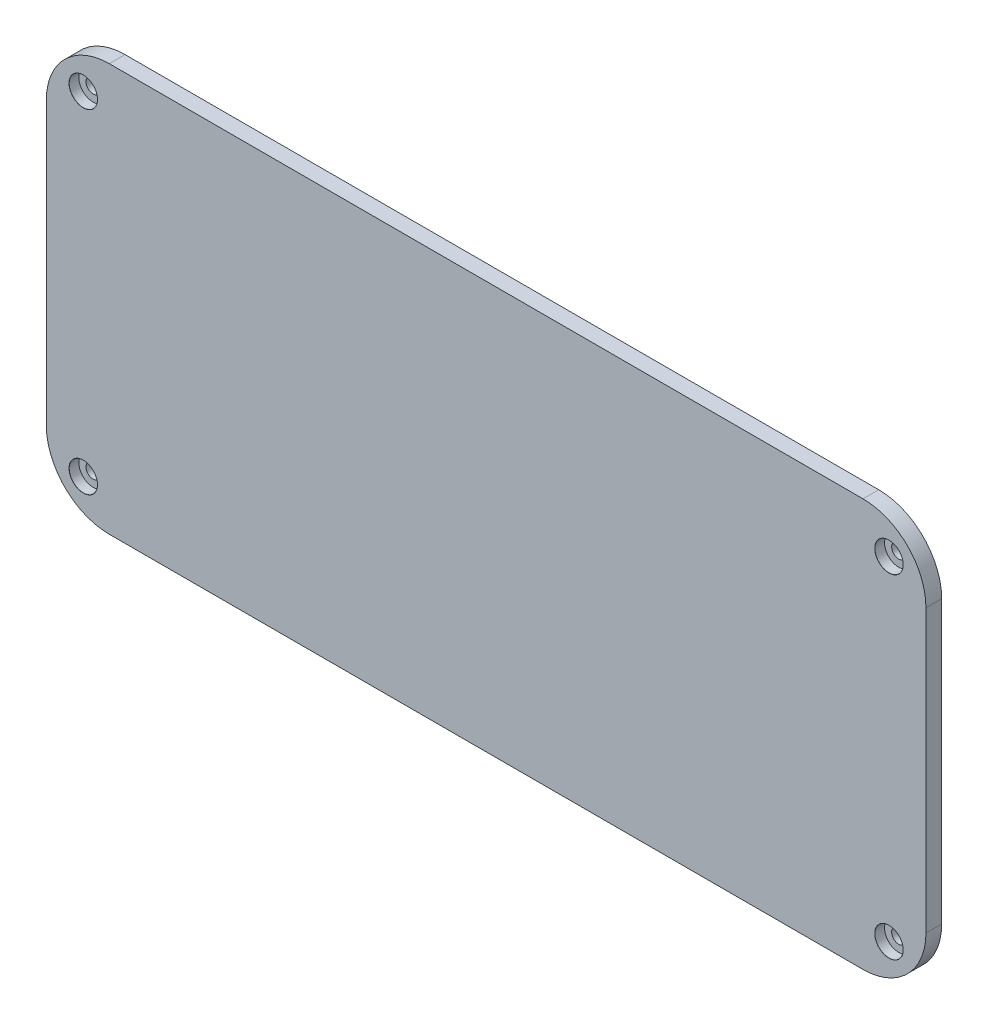
ISO-10303-21;
HEADER;
FILE_DESCRIPTION(('STEP AP214'),'2;1');
FILE_NAME('part.step','',(''),(''),'','','');
FILE_SCHEMA(('AUTOMOTIVE_DESIGN { 1 0 10303 214 1 1 1 1 }'));
ENDSEC;
DATA;
#1=APPLICATION_CONTEXT('core data for automotive mechanical design processes');
#2=APPLICATION_PROTOCOL_DEFINITION('international standard','automotive_design',2000,#1);
#3=PRODUCT_CONTEXT('',#1,'mechanical');
#4=PRODUCT('Part','Part','',(#3));
#5=PRODUCT_RELATED_PRODUCT_CATEGORY('part','',(#4));
#6=PRODUCT_DEFINITION_FORMATION('','',#4);
#7=PRODUCT_DEFINITION_CONTEXT('part definition',#1,'design');
#8=PRODUCT_DEFINITION('design','',#6,#7);
#9=PRODUCT_DEFINITION_SHAPE('','',#8);
#10=(LENGTH_UNIT() NAMED_UNIT(*) SI_UNIT(.MILLI.,.METRE.));
#11=(NAMED_UNIT(*) PLANE_ANGLE_UNIT() SI_UNIT($,.RADIAN.));
#12=(NAMED_UNIT(*) SI_UNIT($,.STERADIAN.) SOLID_ANGLE_UNIT());
#13=UNCERTAINTY_MEASURE_WITH_UNIT(LENGTH_MEASURE(1.E-05),#10,'distance_accuracy_value','');
#14=(GEOMETRIC_REPRESENTATION_CONTEXT(3) GLOBAL_UNCERTAINTY_ASSIGNED_CONTEXT((#13)) GLOBAL_UNIT_ASSIGNED_CONTEXT((#10,
#11,#12)) REPRESENTATION_CONTEXT('',''));
#15=CARTESIAN_POINT('',(0.,0.,0.));
#16=DIRECTION('',(0.,0.,1.));
#17=DIRECTION('',(1.,0.,0.));
#18=AXIS2_PLACEMENT_3D('',#15,#16,#17);
#19=CARTESIAN_POINT('',(-119.75,44.7500000000002,0.));
#20=DIRECTION('',(0.,0.,-1.));
#21=DIRECTION('',(-1.,0.,0.));
#22=AXIS2_PLACEMENT_3D('',#19,#20,#21);
#23=PLANE('',#22);
#24=CARTESIAN_POINT('',(-119.75,44.7500000000002,0.));
#25=DIRECTION('',(0.,0.,1.));
#26=DIRECTION('',(-1.,0.,0.));
#27=AXIS2_PLACEMENT_3D('',#24,#25,#26);
#28=CIRCLE('',#27,20.);
#29=CARTESIAN_POINT('',(-119.75,64.7500000000001,0.));
#30=VERTEX_POINT('',#29);
#31=CARTESIAN_POINT('',(-139.75,44.7500000000001,0.));
#32=VERTEX_POINT('',#31);
#33=EDGE_CURVE('E291',#30,#32,#28,.T.);
#34=ORIENTED_EDGE('',*,*,#33,.F.);
#35=DIRECTION('',(-1.,0.,0.));
#36=VECTOR('',#35,1.);
#37=CARTESIAN_POINT('',(-119.75,64.7500000000001,0.));
#38=LINE('',#37,#36);
#39=CARTESIAN_POINT('',(119.75,64.7500000000002,0.));
#40=VERTEX_POINT('',#39);
#41=EDGE_CURVE('E276',#40,#30,#38,.T.);
#42=ORIENTED_EDGE('',*,*,#41,.F.);
#43=CARTESIAN_POINT('',(119.75,44.7500000000002,0.));
#44=DIRECTION('',(0.,0.,1.));
#45=DIRECTION('',(-1.,0.,0.));
#46=AXIS2_PLACEMENT_3D('',#43,#44,#45);
#47=CIRCLE('',#46,20.);
#48=CARTESIAN_POINT('',(139.75,44.7500000000001,0.));
#49=VERTEX_POINT('',#48);
#50=EDGE_CURVE('E304',#49,#40,#47,.T.);
#51=ORIENTED_EDGE('',*,*,#50,.F.);
#52=DIRECTION('',(0.,1.,0.));
#53=VECTOR('',#52,1.);
#54=CARTESIAN_POINT('',(139.75,44.7500000000001,0.));
#55=LINE('',#54,#53);
#56=CARTESIAN_POINT('',(139.75,-44.7499999999999,0.));
#57=VERTEX_POINT('',#56);
#58=EDGE_CURVE('E302',#57,#49,#55,.T.);
#59=ORIENTED_EDGE('',*,*,#58,.F.);
#60=CARTESIAN_POINT('',(119.75,-44.7499999999999,0.));
#61=DIRECTION('',(0.,0.,1.));
#62=DIRECTION('',(-1.,0.,0.));
#63=AXIS2_PLACEMENT_3D('',#60,#61,#62);
#64=CIRCLE('',#63,20.);
#65=CARTESIAN_POINT('',(119.75,-64.7499999999999,0.));
#66=VERTEX_POINT('',#65);
#67=EDGE_CURVE('E300',#66,#57,#64,.T.);
#68=ORIENTED_EDGE('',*,*,#67,.F.);
#69=DIRECTION('',(1.,0.,0.));
#70=VECTOR('',#69,1.);
#71=CARTESIAN_POINT('',(-119.75,-64.7499999999999,0.));
#72=LINE('',#71,#70);
#73=CARTESIAN_POINT('',(-119.75,-64.7499999999999,0.));
#74=VERTEX_POINT('',#73);
#75=EDGE_CURVE('E298',#74,#66,#72,.T.);
#76=ORIENTED_EDGE('',*,*,#75,.F.);
#77=CARTESIAN_POINT('',(-119.75,-44.7499999999999,0.));
#78=DIRECTION('',(0.,0.,1.));
#79=DIRECTION('',(-1.,0.,0.));
#80=AXIS2_PLACEMENT_3D('',#77,#78,#79);
#81=CIRCLE('',#80,20.);
#82=CARTESIAN_POINT('',(-139.75,-44.7499999999999,0.));
#83=VERTEX_POINT('',#82);
#84=EDGE_CURVE('E296',#83,#74,#81,.T.);
#85=ORIENTED_EDGE('',*,*,#84,.F.);
#86=DIRECTION('',(0.,-1.,0.));
#87=VECTOR('',#86,1.);
#88=CARTESIAN_POINT('',(-139.75,44.7500000000001,0.));
#89=LINE('',#88,#87);
#90=EDGE_CURVE('E294',#32,#83,#89,.T.);
#91=ORIENTED_EDGE('',*,*,#90,.F.);
#92=EDGE_LOOP('',(#34,#42,#51,#59,#68,#76,#85,#91));
#93=FACE_BOUND('',#92,.T.);
#94=CARTESIAN_POINT('',(128.,-53.,0.));
#95=DIRECTION('',(0.,0.,-1.));
#96=DIRECTION('',(-1.,0.,0.));
#97=AXIS2_PLACEMENT_3D('',#94,#95,#96);
#98=CIRCLE('',#97,2.25);
#99=CARTESIAN_POINT('',(125.75,-53.,0.));
#100=VERTEX_POINT('',#99);
#101=EDGE_CURVE('E271',#100,#100,#98,.T.);
#102=ORIENTED_EDGE('',*,*,#101,.F.);
#103=EDGE_LOOP('',(#102));
#104=FACE_BOUND('',#103,.T.);
#105=CARTESIAN_POINT('',(128.,53.,0.));
#106=DIRECTION('',(0.,0.,-1.));
#107=DIRECTION('',(-1.,0.,0.));
#108=AXIS2_PLACEMENT_3D('',#105,#106,#107);
#109=CIRCLE('',#108,2.25);
#110=CARTESIAN_POINT('',(125.75,53.,0.));
#111=VERTEX_POINT('',#110);
#112=EDGE_CURVE('E258',#111,#111,#109,.T.);
#113=ORIENTED_EDGE('',*,*,#112,.F.);
#114=EDGE_LOOP('',(#113));
#115=FACE_BOUND('',#114,.T.);
#116=CARTESIAN_POINT('',(-128.,-53.,0.));
#117=DIRECTION('',(0.,0.,-1.));
#118=DIRECTION('',(-1.,0.,0.));
#119=AXIS2_PLACEMENT_3D('',#116,#117,#118);
#120=CIRCLE('',#119,2.25);
#121=CARTESIAN_POINT('',(-130.25,-53.,0.));
#122=VERTEX_POINT('',#121);
#123=EDGE_CURVE('E245',#122,#122,#120,.T.);
#124=ORIENTED_EDGE('',*,*,#123,.F.);
#125=EDGE_LOOP('',(#124));
#126=FACE_BOUND('',#125,.T.);
#127=CARTESIAN_POINT('',(-128.,53.,0.));
#128=DIRECTION('',(0.,0.,-1.));
#129=DIRECTION('',(-1.,0.,0.));
#130=AXIS2_PLACEMENT_3D('',#127,#128,#129);
#131=CIRCLE('',#130,2.25);
#132=CARTESIAN_POINT('',(-130.25,53.,0.));
#133=VERTEX_POINT('',#132);
#134=EDGE_CURVE('E43',#133,#133,#131,.T.);
#135=ORIENTED_EDGE('',*,*,#134,.F.);
#136=EDGE_LOOP('',(#135));
#137=FACE_BOUND('',#136,.T.);
#138=DIRECTION('',(1.,0.,0.));
#139=VECTOR('',#138,1.);
#140=CARTESIAN_POINT('',(47.75,37.75,0.));
#141=LINE('',#140,#139);
#142=CARTESIAN_POINT('',(-47.75,37.75,0.));
#143=VERTEX_POINT('',#142);
#144=CARTESIAN_POINT('',(47.75,37.75,0.));
#145=VERTEX_POINT('',#144);
#146=EDGE_CURVE('E208',#143,#145,#141,.T.);
#147=ORIENTED_EDGE('',*,*,#146,.F.);
#148=DIRECTION('',(0.,1.,0.));
#149=VECTOR('',#148,1.);
#150=CARTESIAN_POINT('',(-47.75,37.75,0.));
#151=LINE('',#150,#149);
#152=CARTESIAN_POINT('',(-47.75,-37.75,0.));
#153=VERTEX_POINT('',#152);
#154=EDGE_CURVE('E173',#153,#143,#151,.T.);
#155=ORIENTED_EDGE('',*,*,#154,.F.);
#156=DIRECTION('',(-1.,0.,0.));
#157=VECTOR('',#156,1.);
#158=CARTESIAN_POINT('',(47.75,-37.75,0.));
#159=LINE('',#158,#157);
#160=CARTESIAN_POINT('',(47.75,-37.75,0.));
#161=VERTEX_POINT('',#160);
#162=EDGE_CURVE('E199',#161,#153,#159,.T.);
#163=ORIENTED_EDGE('',*,*,#162,.F.);
#164=DIRECTION('',(0.,-1.,0.));
#165=VECTOR('',#164,1.);
#166=CARTESIAN_POINT('',(47.75,37.75,0.));
#167=LINE('',#166,#165);
#168=EDGE_CURVE('E210',#145,#161,#167,.T.);
#169=ORIENTED_EDGE('',*,*,#168,.F.);
#170=EDGE_LOOP('',(#147,#155,#163,#169));
#171=FACE_BOUND('',#170,.T.);
#172=ADVANCED_FACE('F39',(#93,#104,#115,#126,#137,#171),#23,.T.);
#173=CARTESIAN_POINT('',(-119.75,44.7500000000002,5.));
#174=DIRECTION('',(0.,0.,-1.));
#175=DIRECTION('',(-1.,0.,0.));
#176=AXIS2_PLACEMENT_3D('',#173,#174,#175);
#177=CYLINDRICAL_SURFACE('',#176,20.);
#178=ORIENTED_EDGE('',*,*,#33,.T.);
#179=DIRECTION('',(0.,0.,-1.));
#180=VECTOR('',#179,1.);
#181=CARTESIAN_POINT('',(-139.75,44.7500000000001,5.));
#182=LINE('',#181,#180);
#183=CARTESIAN_POINT('',(-139.75,44.7500000000001,5.));
#184=VERTEX_POINT('',#183);
#185=EDGE_CURVE('E11',#184,#32,#182,.T.);
#186=ORIENTED_EDGE('',*,*,#185,.F.);
#187=CARTESIAN_POINT('',(-119.75,44.7500000000002,5.));
#188=DIRECTION('',(0.,0.,1.));
#189=DIRECTION('',(-1.,0.,0.));
#190=AXIS2_PLACEMENT_3D('',#187,#188,#189);
#191=CIRCLE('',#190,20.);
#192=CARTESIAN_POINT('',(-119.75,64.7500000000001,5.));
#193=VERTEX_POINT('',#192);
#194=EDGE_CURVE('E272',#193,#184,#191,.T.);
#195=ORIENTED_EDGE('',*,*,#194,.F.);
#196=DIRECTION('',(0.,0.,-1.));
#197=VECTOR('',#196,1.);
#198=CARTESIAN_POINT('',(-119.75,64.7500000000001,5.));
#199=LINE('',#198,#197);
#200=EDGE_CURVE('E290',#193,#30,#199,.T.);
#201=ORIENTED_EDGE('',*,*,#200,.T.);
#202=EDGE_LOOP('',(#178,#186,#195,#201));
#203=FACE_BOUND('',#202,.T.);
#204=ADVANCED_FACE('F41',(#203),#177,.T.);
#205=CARTESIAN_POINT('',(-139.75,44.7500000000001,5.));
#206=DIRECTION('',(1.,0.,0.));
#207=DIRECTION('',(0.,0.,-1.));
#208=AXIS2_PLACEMENT_3D('',#205,#206,#207);
#209=PLANE('',#208);
#210=ORIENTED_EDGE('',*,*,#90,.T.);
#211=DIRECTION('',(0.,0.,-1.));
#212=VECTOR('',#211,1.);
#213=CARTESIAN_POINT('',(-139.75,-44.7499999999999,5.));
#214=LINE('',#213,#212);
#215=CARTESIAN_POINT('',(-139.75,-44.7499999999999,5.));
#216=VERTEX_POINT('',#215);
#217=EDGE_CURVE('E48',#216,#83,#214,.T.);
#218=ORIENTED_EDGE('',*,*,#217,.F.);
#219=DIRECTION('',(0.,-1.,0.));
#220=VECTOR('',#219,1.);
#221=CARTESIAN_POINT('',(-139.75,44.7500000000001,5.));
#222=LINE('',#221,#220);
#223=EDGE_CURVE('E275',#184,#216,#222,.T.);
#224=ORIENTED_EDGE('',*,*,#223,.F.);
#225=ORIENTED_EDGE('',*,*,#185,.T.);
#226=EDGE_LOOP('',(#210,#218,#224,#225));
#227=FACE_BOUND('',#226,.T.);
#228=ADVANCED_FACE('F464',(#227),#209,.F.);
#229=CARTESIAN_POINT('',(-119.75,-44.7499999999999,5.));
#230=DIRECTION('',(0.,0.,-1.));
#231=DIRECTION('',(-1.,0.,0.));
#232=AXIS2_PLACEMENT_3D('',#229,#230,#231);
#233=CYLINDRICAL_SURFACE('',#232,20.);
#234=ORIENTED_EDGE('',*,*,#84,.T.);
#235=DIRECTION('',(0.,0.,-1.));
#236=VECTOR('',#235,1.);
#237=CARTESIAN_POINT('',(-119.75,-64.7499999999999,5.));
#238=LINE('',#237,#236);
#239=CARTESIAN_POINT('',(-119.75,-64.7499999999999,5.));
#240=VERTEX_POINT('',#239);
#241=EDGE_CURVE('E321',#240,#74,#238,.T.);
#242=ORIENTED_EDGE('',*,*,#241,.F.);
#243=CARTESIAN_POINT('',(-119.75,-44.7499999999999,5.));
#244=DIRECTION('',(0.,0.,1.));
#245=DIRECTION('',(-1.,0.,0.));
#246=AXIS2_PLACEMENT_3D('',#243,#244,#245);
#247=CIRCLE('',#246,20.);
#248=EDGE_CURVE('E278',#216,#240,#247,.T.);
#249=ORIENTED_EDGE('',*,*,#248,.F.);
#250=ORIENTED_EDGE('',*,*,#217,.T.);
#251=EDGE_LOOP('',(#234,#242,#249,#250));
#252=FACE_BOUND('',#251,.T.);
#253=ADVANCED_FACE('F461',(#252),#233,.T.);
#254=CARTESIAN_POINT('',(-119.75,-64.7499999999999,5.));
#255=DIRECTION('',(0.,1.,0.));
#256=DIRECTION('',(-1.,0.,0.));
#257=AXIS2_PLACEMENT_3D('',#254,#255,#256);
#258=PLANE('',#257);
#259=ORIENTED_EDGE('',*,*,#75,.T.);
#260=DIRECTION('',(0.,0.,-1.));
#261=VECTOR('',#260,1.);
#262=CARTESIAN_POINT('',(119.75,-64.7499999999999,5.));
#263=LINE('',#262,#261);
#264=CARTESIAN_POINT('',(119.75,-64.7499999999999,5.));
#265=VERTEX_POINT('',#264);
#266=EDGE_CURVE('E318',#265,#66,#263,.T.);
#267=ORIENTED_EDGE('',*,*,#266,.F.);
#268=DIRECTION('',(1.,0.,0.));
#269=VECTOR('',#268,1.);
#270=CARTESIAN_POINT('',(-119.75,-64.7499999999999,5.));
#271=LINE('',#270,#269);
#272=EDGE_CURVE('E280',#240,#265,#271,.T.);
#273=ORIENTED_EDGE('',*,*,#272,.F.);
#274=ORIENTED_EDGE('',*,*,#241,.T.);
#275=EDGE_LOOP('',(#259,#267,#273,#274));
#276=FACE_BOUND('',#275,.T.);
#277=ADVANCED_FACE('F457',(#276),#258,.F.);
#278=CARTESIAN_POINT('',(119.75,-44.7499999999999,5.));
#279=DIRECTION('',(0.,0.,-1.));
#280=DIRECTION('',(-1.,0.,0.));
#281=AXIS2_PLACEMENT_3D('',#278,#279,#280);
#282=CYLINDRICAL_SURFACE('',#281,20.);
#283=ORIENTED_EDGE('',*,*,#67,.T.);
#284=DIRECTION('',(0.,0.,-1.));
#285=VECTOR('',#284,1.);
#286=CARTESIAN_POINT('',(139.75,-44.7499999999999,5.));
#287=LINE('',#286,#285);
#288=CARTESIAN_POINT('',(139.75,-44.7499999999999,5.));
#289=VERTEX_POINT('',#288);
#290=EDGE_CURVE('E315',#289,#57,#287,.T.);
#291=ORIENTED_EDGE('',*,*,#290,.F.);
#292=CARTESIAN_POINT('',(119.75,-44.7499999999999,5.));
#293=DIRECTION('',(0.,0.,1.));
#294=DIRECTION('',(-1.,0.,0.));
#295=AXIS2_PLACEMENT_3D('',#292,#293,#294);
#296=CIRCLE('',#295,20.);
#297=EDGE_CURVE('E282',#265,#289,#296,.T.);
#298=ORIENTED_EDGE('',*,*,#297,.F.);
#299=ORIENTED_EDGE('',*,*,#266,.T.);
#300=EDGE_LOOP('',(#283,#291,#298,#299));
#301=FACE_BOUND('',#300,.T.);
#302=ADVANCED_FACE('F453',(#301),#282,.T.);
#303=CARTESIAN_POINT('',(139.75,44.7500000000001,5.));
#304=DIRECTION('',(-1.,0.,0.));
#305=DIRECTION('',(0.,0.,1.));
#306=AXIS2_PLACEMENT_3D('',#303,#304,#305);
#307=PLANE('',#306);
#308=ORIENTED_EDGE('',*,*,#58,.T.);
#309=DIRECTION('',(0.,0.,-1.));
#310=VECTOR('',#309,1.);
#311=CARTESIAN_POINT('',(139.75,44.7500000000001,5.));
#312=LINE('',#311,#310);
#313=CARTESIAN_POINT('',(139.75,44.7500000000001,5.));
#314=VERTEX_POINT('',#313);
#315=EDGE_CURVE('E312',#314,#49,#312,.T.);
#316=ORIENTED_EDGE('',*,*,#315,.F.);
#317=DIRECTION('',(0.,1.,0.));
#318=VECTOR('',#317,1.);
#319=CARTESIAN_POINT('',(139.75,44.7500000000001,5.));
#320=LINE('',#319,#318);
#321=EDGE_CURVE('E284',#289,#314,#320,.T.);
#322=ORIENTED_EDGE('',*,*,#321,.F.);
#323=ORIENTED_EDGE('',*,*,#290,.T.);
#324=EDGE_LOOP('',(#308,#316,#322,#323));
#325=FACE_BOUND('',#324,.T.);
#326=ADVANCED_FACE('F449',(#325),#307,.F.);
#327=CARTESIAN_POINT('',(119.75,44.7500000000002,5.));
#328=DIRECTION('',(0.,0.,-1.));
#329=DIRECTION('',(-1.,0.,0.));
#330=AXIS2_PLACEMENT_3D('',#327,#328,#329);
#331=CYLINDRICAL_SURFACE('',#330,20.);
#332=ORIENTED_EDGE('',*,*,#50,.T.);
#333=DIRECTION('',(0.,0.,-1.));
#334=VECTOR('',#333,1.);
#335=CARTESIAN_POINT('',(119.75,64.7500000000002,5.));
#336=LINE('',#335,#334);
#337=CARTESIAN_POINT('',(119.75,64.7500000000002,5.));
#338=VERTEX_POINT('',#337);
#339=EDGE_CURVE('E309',#338,#40,#336,.T.);
#340=ORIENTED_EDGE('',*,*,#339,.F.);
#341=CARTESIAN_POINT('',(119.75,44.7500000000002,5.));
#342=DIRECTION('',(0.,0.,1.));
#343=DIRECTION('',(-1.,0.,0.));
#344=AXIS2_PLACEMENT_3D('',#341,#342,#343);
#345=CIRCLE('',#344,20.);
#346=EDGE_CURVE('E286',#314,#338,#345,.T.);
#347=ORIENTED_EDGE('',*,*,#346,.F.);
#348=ORIENTED_EDGE('',*,*,#315,.T.);
#349=EDGE_LOOP('',(#332,#340,#347,#348));
#350=FACE_BOUND('',#349,.T.);
#351=ADVANCED_FACE('F445',(#350),#331,.T.);
#352=CARTESIAN_POINT('',(-119.75,64.7500000000001,5.));
#353=DIRECTION('',(0.,-1.,0.));
#354=DIRECTION('',(1.,0.,0.));
#355=AXIS2_PLACEMENT_3D('',#352,#353,#354);
#356=PLANE('',#355);
#357=ORIENTED_EDGE('',*,*,#41,.T.);
#358=ORIENTED_EDGE('',*,*,#200,.F.);
#359=DIRECTION('',(-1.,0.,0.));
#360=VECTOR('',#359,1.);
#361=CARTESIAN_POINT('',(-119.75,64.7500000000001,5.));
#362=LINE('',#361,#360);
#363=EDGE_CURVE('E288',#338,#193,#362,.T.);
#364=ORIENTED_EDGE('',*,*,#363,.F.);
#365=ORIENTED_EDGE('',*,*,#339,.T.);
#366=EDGE_LOOP('',(#357,#358,#364,#365));
#367=FACE_BOUND('',#366,.T.);
#368=ADVANCED_FACE('F438',(#367),#356,.F.);
#369=CARTESIAN_POINT('',(-119.75,44.7500000000002,5.));
#370=DIRECTION('',(0.,0.,-1.));
#371=DIRECTION('',(-1.,0.,0.));
#372=AXIS2_PLACEMENT_3D('',#369,#370,#371);
#373=PLANE('',#372);
#374=CARTESIAN_POINT('',(-128.,53.,5.));
#375=DIRECTION('',(0.,0.,1.));
#376=DIRECTION('',(1.,0.,0.));
#377=AXIS2_PLACEMENT_3D('',#374,#375,#376);
#378=CIRCLE('',#377,4.525);
#379=CARTESIAN_POINT('',(-123.475,53.,5.));
#380=VERTEX_POINT('',#379);
#381=EDGE_CURVE('E221',#380,#380,#378,.T.);
#382=ORIENTED_EDGE('',*,*,#381,.F.);
#383=EDGE_LOOP('',(#382));
#384=FACE_BOUND('',#383,.T.);
#385=CARTESIAN_POINT('',(-128.,-53.,5.));
#386=DIRECTION('',(0.,0.,1.));
#387=DIRECTION('',(1.,0.,0.));
#388=AXIS2_PLACEMENT_3D('',#385,#386,#387);
#389=CIRCLE('',#388,4.525);
#390=CARTESIAN_POINT('',(-123.475,-53.,5.));
#391=VERTEX_POINT('',#390);
#392=EDGE_CURVE('E233',#391,#391,#389,.T.);
#393=ORIENTED_EDGE('',*,*,#392,.F.);
#394=EDGE_LOOP('',(#393));
#395=FACE_BOUND('',#394,.T.);
#396=CARTESIAN_POINT('',(128.,53.,5.));
#397=DIRECTION('',(0.,0.,1.));
#398=DIRECTION('',(1.,0.,0.));
#399=AXIS2_PLACEMENT_3D('',#396,#397,#398);
#400=CIRCLE('',#399,4.525);
#401=CARTESIAN_POINT('',(132.525,53.,5.));
#402=VERTEX_POINT('',#401);
#403=EDGE_CURVE('E246',#402,#402,#400,.T.);
#404=ORIENTED_EDGE('',*,*,#403,.F.);
#405=EDGE_LOOP('',(#404));
#406=FACE_BOUND('',#405,.T.);
#407=CARTESIAN_POINT('',(128.,-53.,5.));
#408=DIRECTION('',(0.,0.,1.));
#409=DIRECTION('',(1.,0.,0.));
#410=AXIS2_PLACEMENT_3D('',#407,#408,#409);
#411=CIRCLE('',#410,4.525);
#412=CARTESIAN_POINT('',(132.525,-53.,5.));
#413=VERTEX_POINT('',#412);
#414=EDGE_CURVE('E259',#413,#413,#411,.T.);
#415=ORIENTED_EDGE('',*,*,#414,.F.);
#416=EDGE_LOOP('',(#415));
#417=FACE_BOUND('',#416,.T.);
#418=ORIENTED_EDGE('',*,*,#194,.T.);
#419=ORIENTED_EDGE('',*,*,#223,.T.);
#420=ORIENTED_EDGE('',*,*,#248,.T.);
#421=ORIENTED_EDGE('',*,*,#272,.T.);
#422=ORIENTED_EDGE('',*,*,#297,.T.);
#423=ORIENTED_EDGE('',*,*,#321,.T.);
#424=ORIENTED_EDGE('',*,*,#346,.T.);
#425=ORIENTED_EDGE('',*,*,#363,.T.);
#426=EDGE_LOOP('',(#418,#419,#420,#421,#422,#423,#424,#425));
#427=FACE_BOUND('',#426,.T.);
#428=ADVANCED_FACE('F435',(#384,#395,#406,#417,#427),#373,.F.);
#429=CARTESIAN_POINT('',(128.,-53.,5.));
#430=DIRECTION('',(0.,0.,1.));
#431=DIRECTION('',(1.,0.,0.));
#432=AXIS2_PLACEMENT_3D('',#429,#430,#431);
#433=CYLINDRICAL_SURFACE('',#432,2.25);
#434=ORIENTED_EDGE('',*,*,#101,.T.);
#435=EDGE_LOOP('',(#434));
#436=FACE_BOUND('',#435,.T.);
#437=CARTESIAN_POINT('',(128.,-53.,1.90000000000001));
#438=DIRECTION('',(0.,0.,1.));
#439=DIRECTION('',(1.,0.,0.));
#440=AXIS2_PLACEMENT_3D('',#437,#438,#439);
#441=CIRCLE('',#440,2.25);
#442=CARTESIAN_POINT('',(130.25,-53.,1.90000000000001));
#443=VERTEX_POINT('',#442);
#444=EDGE_CURVE('E268',#443,#443,#441,.T.);
#445=ORIENTED_EDGE('',*,*,#444,.T.);
#446=EDGE_LOOP('',(#445));
#447=FACE_BOUND('',#446,.T.);
#448=ADVANCED_FACE('F431',(#436,#447),#433,.F.);
#449=CARTESIAN_POINT('',(130.25,-53.,1.90000000000001));
#450=DIRECTION('',(0.,0.,-1.));
#451=DIRECTION('',(-1.,0.,0.));
#452=AXIS2_PLACEMENT_3D('',#449,#450,#451);
#453=PLANE('',#452);
#454=ORIENTED_EDGE('',*,*,#444,.F.);
#455=EDGE_LOOP('',(#454));
#456=FACE_BOUND('',#455,.T.);
#457=CARTESIAN_POINT('',(128.,-53.,1.90000000000001));
#458=DIRECTION('',(0.,0.,1.));
#459=DIRECTION('',(1.,0.,0.));
#460=AXIS2_PLACEMENT_3D('',#457,#458,#459);
#461=CIRCLE('',#460,4.5);
#462=CARTESIAN_POINT('',(132.5,-53.,1.90000000000001));
#463=VERTEX_POINT('',#462);
#464=EDGE_CURVE('E265',#463,#463,#461,.T.);
#465=ORIENTED_EDGE('',*,*,#464,.T.);
#466=EDGE_LOOP('',(#465));
#467=FACE_BOUND('',#466,.T.);
#468=ADVANCED_FACE('F427',(#456,#467),#453,.F.);
#469=CARTESIAN_POINT('',(128.,-53.,5.));
#470=DIRECTION('',(0.,0.,1.));
#471=DIRECTION('',(1.,0.,0.));
#472=AXIS2_PLACEMENT_3D('',#469,#470,#471);
#473=CYLINDRICAL_SURFACE('',#472,4.5);
#474=ORIENTED_EDGE('',*,*,#464,.F.);
#475=EDGE_LOOP('',(#474));
#476=FACE_BOUND('',#475,.T.);
#477=CARTESIAN_POINT('',(128.,-53.,4.975));
#478=DIRECTION('',(0.,0.,1.));
#479=DIRECTION('',(1.,0.,0.));
#480=AXIS2_PLACEMENT_3D('',#477,#478,#479);
#481=CIRCLE('',#480,4.5);
#482=CARTESIAN_POINT('',(132.5,-53.,4.975));
#483=VERTEX_POINT('',#482);
#484=EDGE_CURVE('E262',#483,#483,#481,.T.);
#485=ORIENTED_EDGE('',*,*,#484,.T.);
#486=EDGE_LOOP('',(#485));
#487=FACE_BOUND('',#486,.T.);
#488=ADVANCED_FACE('F423',(#476,#487),#473,.F.);
#489=CARTESIAN_POINT('',(128.,-53.,5.));
#490=DIRECTION('',(0.,0.,1.));
#491=DIRECTION('',(1.,0.,0.));
#492=AXIS2_PLACEMENT_3D('',#489,#490,#491);
#493=CONICAL_SURFACE('',#492,4.525,0.785398163397362);
#494=ORIENTED_EDGE('',*,*,#484,.F.);
#495=EDGE_LOOP('',(#494));
#496=FACE_BOUND('',#495,.T.);
#497=ORIENTED_EDGE('',*,*,#414,.T.);
#498=EDGE_LOOP('',(#497));
#499=FACE_BOUND('',#498,.T.);
#500=ADVANCED_FACE('F419',(#496,#499),#493,.F.);
#501=CARTESIAN_POINT('',(128.,53.,5.));
#502=DIRECTION('',(0.,0.,1.));
#503=DIRECTION('',(1.,0.,0.));
#504=AXIS2_PLACEMENT_3D('',#501,#502,#503);
#505=CYLINDRICAL_SURFACE('',#504,2.25);
#506=ORIENTED_EDGE('',*,*,#112,.T.);
#507=EDGE_LOOP('',(#506));
#508=FACE_BOUND('',#507,.T.);
#509=CARTESIAN_POINT('',(128.,53.,1.90000000000001));
#510=DIRECTION('',(0.,0.,1.));
#511=DIRECTION('',(1.,0.,0.));
#512=AXIS2_PLACEMENT_3D('',#509,#510,#511);
#513=CIRCLE('',#512,2.25);
#514=CARTESIAN_POINT('',(130.25,53.,1.90000000000001));
#515=VERTEX_POINT('',#514);
#516=EDGE_CURVE('E255',#515,#515,#513,.T.);
#517=ORIENTED_EDGE('',*,*,#516,.T.);
#518=EDGE_LOOP('',(#517));
#519=FACE_BOUND('',#518,.T.);
#520=ADVANCED_FACE('F415',(#508,#519),#505,.F.);
#521=CARTESIAN_POINT('',(130.25,53.,1.90000000000001));
#522=DIRECTION('',(0.,0.,-1.));
#523=DIRECTION('',(-1.,0.,0.));
#524=AXIS2_PLACEMENT_3D('',#521,#522,#523);
#525=PLANE('',#524);
#526=ORIENTED_EDGE('',*,*,#516,.F.);
#527=EDGE_LOOP('',(#526));
#528=FACE_BOUND('',#527,.T.);
#529=CARTESIAN_POINT('',(128.,53.,1.90000000000001));
#530=DIRECTION('',(0.,0.,1.));
#531=DIRECTION('',(1.,0.,0.));
#532=AXIS2_PLACEMENT_3D('',#529,#530,#531);
#533=CIRCLE('',#532,4.5);
#534=CARTESIAN_POINT('',(132.5,53.,1.90000000000001));
#535=VERTEX_POINT('',#534);
#536=EDGE_CURVE('E252',#535,#535,#533,.T.);
#537=ORIENTED_EDGE('',*,*,#536,.T.);
#538=EDGE_LOOP('',(#537));
#539=FACE_BOUND('',#538,.T.);
#540=ADVANCED_FACE('F411',(#528,#539),#525,.F.);
#541=CARTESIAN_POINT('',(128.,53.,5.));
#542=DIRECTION('',(0.,0.,1.));
#543=DIRECTION('',(1.,0.,0.));
#544=AXIS2_PLACEMENT_3D('',#541,#542,#543);
#545=CYLINDRICAL_SURFACE('',#544,4.5);
#546=ORIENTED_EDGE('',*,*,#536,.F.);
#547=EDGE_LOOP('',(#546));
#548=FACE_BOUND('',#547,.T.);
#549=CARTESIAN_POINT('',(128.,53.,4.975));
#550=DIRECTION('',(0.,0.,1.));
#551=DIRECTION('',(1.,0.,0.));
#552=AXIS2_PLACEMENT_3D('',#549,#550,#551);
#553=CIRCLE('',#552,4.5);
#554=CARTESIAN_POINT('',(132.5,53.,4.975));
#555=VERTEX_POINT('',#554);
#556=EDGE_CURVE('E249',#555,#555,#553,.T.);
#557=ORIENTED_EDGE('',*,*,#556,.T.);
#558=EDGE_LOOP('',(#557));
#559=FACE_BOUND('',#558,.T.);
#560=ADVANCED_FACE('F407',(#548,#559),#545,.F.);
#561=CARTESIAN_POINT('',(128.,53.,5.));
#562=DIRECTION('',(0.,0.,1.));
#563=DIRECTION('',(1.,0.,0.));
#564=AXIS2_PLACEMENT_3D('',#561,#562,#563);
#565=CONICAL_SURFACE('',#564,4.525,0.785398163397362);
#566=ORIENTED_EDGE('',*,*,#556,.F.);
#567=EDGE_LOOP('',(#566));
#568=FACE_BOUND('',#567,.T.);
#569=ORIENTED_EDGE('',*,*,#403,.T.);
#570=EDGE_LOOP('',(#569));
#571=FACE_BOUND('',#570,.T.);
#572=ADVANCED_FACE('F404',(#568,#571),#565,.F.);
#573=CARTESIAN_POINT('',(-128.,-53.,5.));
#574=DIRECTION('',(0.,0.,1.));
#575=DIRECTION('',(1.,0.,0.));
#576=AXIS2_PLACEMENT_3D('',#573,#574,#575);
#577=CYLINDRICAL_SURFACE('',#576,2.25);
#578=ORIENTED_EDGE('',*,*,#123,.T.);
#579=EDGE_LOOP('',(#578));
#580=FACE_BOUND('',#579,.T.);
#581=CARTESIAN_POINT('',(-128.,-53.,1.90000000000001));
#582=DIRECTION('',(0.,0.,1.));
#583=DIRECTION('',(1.,0.,0.));
#584=AXIS2_PLACEMENT_3D('',#581,#582,#583);
#585=CIRCLE('',#584,2.25);
#586=CARTESIAN_POINT('',(-125.75,-53.,1.90000000000001));
#587=VERTEX_POINT('',#586);
#588=EDGE_CURVE('E242',#587,#587,#585,.T.);
#589=ORIENTED_EDGE('',*,*,#588,.T.);
#590=EDGE_LOOP('',(#589));
#591=FACE_BOUND('',#590,.T.);
#592=ADVANCED_FACE('F332',(#580,#591),#577,.F.);
#593=CARTESIAN_POINT('',(-125.75,-53.,1.90000000000001));
#594=DIRECTION('',(0.,0.,-1.));
#595=DIRECTION('',(-1.,0.,0.));
#596=AXIS2_PLACEMENT_3D('',#593,#594,#595);
#597=PLANE('',#596);
#598=ORIENTED_EDGE('',*,*,#588,.F.);
#599=EDGE_LOOP('',(#598));
#600=FACE_BOUND('',#599,.T.);
#601=CARTESIAN_POINT('',(-128.,-53.,1.90000000000001));
#602=DIRECTION('',(0.,0.,1.));
#603=DIRECTION('',(1.,0.,0.));
#604=AXIS2_PLACEMENT_3D('',#601,#602,#603);
#605=CIRCLE('',#604,4.5);
#606=CARTESIAN_POINT('',(-123.5,-53.,1.90000000000001));
#607=VERTEX_POINT('',#606);
#608=EDGE_CURVE('E239',#607,#607,#605,.T.);
#609=ORIENTED_EDGE('',*,*,#608,.T.);
#610=EDGE_LOOP('',(#609));
#611=FACE_BOUND('',#610,.T.);
#612=ADVANCED_FACE('F397',(#600,#611),#597,.F.);
#613=CARTESIAN_POINT('',(-128.,-53.,5.));
#614=DIRECTION('',(0.,0.,1.));
#615=DIRECTION('',(1.,0.,0.));
#616=AXIS2_PLACEMENT_3D('',#613,#614,#615);
#617=CYLINDRICAL_SURFACE('',#616,4.5);
#618=ORIENTED_EDGE('',*,*,#608,.F.);
#619=EDGE_LOOP('',(#618));
#620=FACE_BOUND('',#619,.T.);
#621=CARTESIAN_POINT('',(-128.,-53.,4.975));
#622=DIRECTION('',(0.,0.,1.));
#623=DIRECTION('',(1.,0.,0.));
#624=AXIS2_PLACEMENT_3D('',#621,#622,#623);
#625=CIRCLE('',#624,4.5);
#626=CARTESIAN_POINT('',(-123.5,-53.,4.975));
#627=VERTEX_POINT('',#626);
#628=EDGE_CURVE('E236',#627,#627,#625,.T.);
#629=ORIENTED_EDGE('',*,*,#628,.T.);
#630=EDGE_LOOP('',(#629));
#631=FACE_BOUND('',#630,.T.);
#632=ADVANCED_FACE('F393',(#620,#631),#617,.F.);
#633=CARTESIAN_POINT('',(-128.,-53.,5.));
#634=DIRECTION('',(0.,0.,1.));
#635=DIRECTION('',(1.,0.,0.));
#636=AXIS2_PLACEMENT_3D('',#633,#634,#635);
#637=CONICAL_SURFACE('',#636,4.525,0.785398163397362);
#638=ORIENTED_EDGE('',*,*,#628,.F.);
#639=EDGE_LOOP('',(#638));
#640=FACE_BOUND('',#639,.T.);
#641=ORIENTED_EDGE('',*,*,#392,.T.);
#642=EDGE_LOOP('',(#641));
#643=FACE_BOUND('',#642,.T.);
#644=ADVANCED_FACE('F389',(#640,#643),#637,.F.);
#645=CARTESIAN_POINT('',(-128.,53.,5.));
#646=DIRECTION('',(0.,0.,1.));
#647=DIRECTION('',(1.,0.,0.));
#648=AXIS2_PLACEMENT_3D('',#645,#646,#647);
#649=CYLINDRICAL_SURFACE('',#648,2.25);
#650=ORIENTED_EDGE('',*,*,#134,.T.);
#651=EDGE_LOOP('',(#650));
#652=FACE_BOUND('',#651,.T.);
#653=CARTESIAN_POINT('',(-128.,53.,1.90000000000001));
#654=DIRECTION('',(0.,0.,1.));
#655=DIRECTION('',(1.,0.,0.));
#656=AXIS2_PLACEMENT_3D('',#653,#654,#655);
#657=CIRCLE('',#656,2.25);
#658=CARTESIAN_POINT('',(-125.75,53.,1.90000000000001));
#659=VERTEX_POINT('',#658);
#660=EDGE_CURVE('E230',#659,#659,#657,.T.);
#661=ORIENTED_EDGE('',*,*,#660,.T.);
#662=EDGE_LOOP('',(#661));
#663=FACE_BOUND('',#662,.T.);
#664=ADVANCED_FACE('F385',(#652,#663),#649,.F.);
#665=CARTESIAN_POINT('',(-125.75,53.,1.90000000000001));
#666=DIRECTION('',(0.,0.,-1.));
#667=DIRECTION('',(-1.,0.,0.));
#668=AXIS2_PLACEMENT_3D('',#665,#666,#667);
#669=PLANE('',#668);
#670=ORIENTED_EDGE('',*,*,#660,.F.);
#671=EDGE_LOOP('',(#670));
#672=FACE_BOUND('',#671,.T.);
#673=CARTESIAN_POINT('',(-128.,53.,1.90000000000001));
#674=DIRECTION('',(0.,0.,1.));
#675=DIRECTION('',(1.,0.,0.));
#676=AXIS2_PLACEMENT_3D('',#673,#674,#675);
#677=CIRCLE('',#676,4.5);
#678=CARTESIAN_POINT('',(-123.5,53.,1.90000000000001));
#679=VERTEX_POINT('',#678);
#680=EDGE_CURVE('E227',#679,#679,#677,.T.);
#681=ORIENTED_EDGE('',*,*,#680,.T.);
#682=EDGE_LOOP('',(#681));
#683=FACE_BOUND('',#682,.T.);
#684=ADVANCED_FACE('F381',(#672,#683),#669,.F.);
#685=CARTESIAN_POINT('',(-128.,53.,5.));
#686=DIRECTION('',(0.,0.,1.));
#687=DIRECTION('',(1.,0.,0.));
#688=AXIS2_PLACEMENT_3D('',#685,#686,#687);
#689=CYLINDRICAL_SURFACE('',#688,4.5);
#690=ORIENTED_EDGE('',*,*,#680,.F.);
#691=EDGE_LOOP('',(#690));
#692=FACE_BOUND('',#691,.T.);
#693=CARTESIAN_POINT('',(-128.,53.,4.975));
#694=DIRECTION('',(0.,0.,1.));
#695=DIRECTION('',(1.,0.,0.));
#696=AXIS2_PLACEMENT_3D('',#693,#694,#695);
#697=CIRCLE('',#696,4.5);
#698=CARTESIAN_POINT('',(-123.5,53.,4.975));
#699=VERTEX_POINT('',#698);
#700=EDGE_CURVE('E224',#699,#699,#697,.T.);
#701=ORIENTED_EDGE('',*,*,#700,.T.);
#702=EDGE_LOOP('',(#701));
#703=FACE_BOUND('',#702,.T.);
#704=ADVANCED_FACE('F377',(#692,#703),#689,.F.);
#705=CARTESIAN_POINT('',(-128.,53.,5.));
#706=DIRECTION('',(0.,0.,1.));
#707=DIRECTION('',(1.,0.,0.));
#708=AXIS2_PLACEMENT_3D('',#705,#706,#707);
#709=CONICAL_SURFACE('',#708,4.525,0.785398163397362);
#710=ORIENTED_EDGE('',*,*,#700,.F.);
#711=EDGE_LOOP('',(#710));
#712=FACE_BOUND('',#711,.T.);
#713=ORIENTED_EDGE('',*,*,#381,.T.);
#714=EDGE_LOOP('',(#713));
#715=FACE_BOUND('',#714,.T.);
#716=ADVANCED_FACE('F374',(#712,#715),#709,.F.);
#717=CARTESIAN_POINT('',(0.,0.,-10.));
#718=DIRECTION('',(0.,0.,-1.));
#719=DIRECTION('',(-1.,0.,0.));
#720=AXIS2_PLACEMENT_3D('',#717,#718,#719);
#721=PLANE('',#720);
#722=DIRECTION('',(0.,1.,0.));
#723=VECTOR('',#722,1.);
#724=CARTESIAN_POINT('',(-47.75,37.75,-10.));
#725=LINE('',#724,#723);
#726=CARTESIAN_POINT('',(-47.75,-37.75,-10.));
#727=VERTEX_POINT('',#726);
#728=CARTESIAN_POINT('',(-47.75,37.75,-10.));
#729=VERTEX_POINT('',#728);
#730=EDGE_CURVE('E195',#727,#729,#725,.T.);
#731=ORIENTED_EDGE('',*,*,#730,.T.);
#732=DIRECTION('',(1.,0.,0.));
#733=VECTOR('',#732,1.);
#734=CARTESIAN_POINT('',(47.75,37.75,-10.));
#735=LINE('',#734,#733);
#736=CARTESIAN_POINT('',(47.75,37.75,-10.));
#737=VERTEX_POINT('',#736);
#738=EDGE_CURVE('E198',#729,#737,#735,.T.);
#739=ORIENTED_EDGE('',*,*,#738,.T.);
#740=DIRECTION('',(0.,-1.,0.));
#741=VECTOR('',#740,1.);
#742=CARTESIAN_POINT('',(47.75,37.75,-10.));
#743=LINE('',#742,#741);
#744=CARTESIAN_POINT('',(47.75,-37.75,-10.));
#745=VERTEX_POINT('',#744);
#746=EDGE_CURVE('E201',#737,#745,#743,.T.);
#747=ORIENTED_EDGE('',*,*,#746,.T.);
#748=DIRECTION('',(-1.,0.,0.));
#749=VECTOR('',#748,1.);
#750=CARTESIAN_POINT('',(47.75,-37.75,-10.));
#751=LINE('',#750,#749);
#752=EDGE_CURVE('E203',#745,#727,#751,.T.);
#753=ORIENTED_EDGE('',*,*,#752,.T.);
#754=EDGE_LOOP('',(#731,#739,#747,#753));
#755=FACE_BOUND('',#754,.T.);
#756=DIRECTION('',(1.,0.,0.));
#757=VECTOR('',#756,1.);
#758=CARTESIAN_POINT('',(37.75,27.75,-10.));
#759=LINE('',#758,#757);
#760=CARTESIAN_POINT('',(-37.75,27.75,-10.));
#761=VERTEX_POINT('',#760);
#762=CARTESIAN_POINT('',(37.75,27.75,-10.));
#763=VERTEX_POINT('',#762);
#764=EDGE_CURVE('E165',#761,#763,#759,.T.);
#765=ORIENTED_EDGE('',*,*,#764,.F.);
#766=DIRECTION('',(0.,1.,0.));
#767=VECTOR('',#766,1.);
#768=CARTESIAN_POINT('',(-37.75,27.75,-10.));
#769=LINE('',#768,#767);
#770=CARTESIAN_POINT('',(-37.75,-27.75,-10.));
#771=VERTEX_POINT('',#770);
#772=EDGE_CURVE('E156',#771,#761,#769,.T.);
#773=ORIENTED_EDGE('',*,*,#772,.F.);
#774=DIRECTION('',(-1.,0.,0.));
#775=VECTOR('',#774,1.);
#776=CARTESIAN_POINT('',(37.75,-27.75,-10.));
#777=LINE('',#776,#775);
#778=CARTESIAN_POINT('',(37.75,-27.75,-10.));
#779=VERTEX_POINT('',#778);
#780=EDGE_CURVE('E181',#779,#771,#777,.T.);
#781=ORIENTED_EDGE('',*,*,#780,.F.);
#782=DIRECTION('',(0.,-1.,0.));
#783=VECTOR('',#782,1.);
#784=CARTESIAN_POINT('',(37.75,27.75,-10.));
#785=LINE('',#784,#783);
#786=EDGE_CURVE('E179',#763,#779,#785,.T.);
#787=ORIENTED_EDGE('',*,*,#786,.F.);
#788=EDGE_LOOP('',(#765,#773,#781,#787));
#789=FACE_BOUND('',#788,.T.);
#790=ADVANCED_FACE('F177',(#755,#789),#721,.T.);
#791=CARTESIAN_POINT('',(-47.75,37.75,-10.));
#792=DIRECTION('',(1.,0.,0.));
#793=DIRECTION('',(0.,0.,-1.));
#794=AXIS2_PLACEMENT_3D('',#791,#792,#793);
#795=PLANE('',#794);
#796=ORIENTED_EDGE('',*,*,#154,.T.);
#797=DIRECTION('',(0.,0.,1.));
#798=VECTOR('',#797,1.);
#799=CARTESIAN_POINT('',(-47.75,37.75,-10.));
#800=LINE('',#799,#798);
#801=EDGE_CURVE('E219',#729,#143,#800,.T.);
#802=ORIENTED_EDGE('',*,*,#801,.F.);
#803=ORIENTED_EDGE('',*,*,#730,.F.);
#804=DIRECTION('',(0.,0.,1.));
#805=VECTOR('',#804,1.);
#806=CARTESIAN_POINT('',(-47.75,-37.75,-10.));
#807=LINE('',#806,#805);
#808=EDGE_CURVE('E205',#727,#153,#807,.T.);
#809=ORIENTED_EDGE('',*,*,#808,.T.);
#810=EDGE_LOOP('',(#796,#802,#803,#809));
#811=FACE_BOUND('',#810,.T.);
#812=ADVANCED_FACE('F358',(#811),#795,.F.);
#813=CARTESIAN_POINT('',(47.75,37.75,-10.));
#814=DIRECTION('',(0.,-1.,0.));
#815=DIRECTION('',(0.,0.,-1.));
#816=AXIS2_PLACEMENT_3D('',#813,#814,#815);
#817=PLANE('',#816);
#818=ORIENTED_EDGE('',*,*,#146,.T.);
#819=DIRECTION('',(0.,0.,1.));
#820=VECTOR('',#819,1.);
#821=CARTESIAN_POINT('',(47.75,37.75,-10.));
#822=LINE('',#821,#820);
#823=EDGE_CURVE('E216',#737,#145,#822,.T.);
#824=ORIENTED_EDGE('',*,*,#823,.F.);
#825=ORIENTED_EDGE('',*,*,#738,.F.);
#826=ORIENTED_EDGE('',*,*,#801,.T.);
#827=EDGE_LOOP('',(#818,#824,#825,#826));
#828=FACE_BOUND('',#827,.T.);
#829=ADVANCED_FACE('F349',(#828),#817,.F.);
#830=CARTESIAN_POINT('',(47.75,37.75,-10.));
#831=DIRECTION('',(-1.,0.,0.));
#832=DIRECTION('',(0.,0.,1.));
#833=AXIS2_PLACEMENT_3D('',#830,#831,#832);
#834=PLANE('',#833);
#835=ORIENTED_EDGE('',*,*,#168,.T.);
#836=DIRECTION('',(0.,0.,1.));
#837=VECTOR('',#836,1.);
#838=CARTESIAN_POINT('',(47.75,-37.75,-10.));
#839=LINE('',#838,#837);
#840=EDGE_CURVE('E56',#745,#161,#839,.T.);
#841=ORIENTED_EDGE('',*,*,#840,.F.);
#842=ORIENTED_EDGE('',*,*,#746,.F.);
#843=ORIENTED_EDGE('',*,*,#823,.T.);
#844=EDGE_LOOP('',(#835,#841,#842,#843));
#845=FACE_BOUND('',#844,.T.);
#846=ADVANCED_FACE('F353',(#845),#834,.F.);
#847=CARTESIAN_POINT('',(47.75,-37.75,-10.));
#848=DIRECTION('',(0.,1.,0.));
#849=DIRECTION('',(0.,0.,1.));
#850=AXIS2_PLACEMENT_3D('',#847,#848,#849);
#851=PLANE('',#850);
#852=ORIENTED_EDGE('',*,*,#162,.T.);
#853=ORIENTED_EDGE('',*,*,#808,.F.);
#854=ORIENTED_EDGE('',*,*,#752,.F.);
#855=ORIENTED_EDGE('',*,*,#840,.T.);
#856=EDGE_LOOP('',(#852,#853,#854,#855));
#857=FACE_BOUND('',#856,.T.);
#858=ADVANCED_FACE('F359',(#857),#851,.F.);
#859=CARTESIAN_POINT('',(-37.75,27.75,-10.));
#860=DIRECTION('',(1.,0.,0.));
#861=DIRECTION('',(0.,0.,-1.));
#862=AXIS2_PLACEMENT_3D('',#859,#860,#861);
#863=PLANE('',#862);
#864=DIRECTION('',(0.,1.,0.));
#865=VECTOR('',#864,1.);
#866=CARTESIAN_POINT('',(-37.75,27.75,0.));
#867=LINE('',#866,#865);
#868=CARTESIAN_POINT('',(-37.75,-27.75,0.));
#869=VERTEX_POINT('',#868);
#870=CARTESIAN_POINT('',(-37.75,27.75,0.));
#871=VERTEX_POINT('',#870);
#872=EDGE_CURVE('E64',#869,#871,#867,.T.);
#873=ORIENTED_EDGE('',*,*,#872,.F.);
#874=DIRECTION('',(0.,0.,1.));
#875=VECTOR('',#874,1.);
#876=CARTESIAN_POINT('',(-37.75,-27.75,-10.));
#877=LINE('',#876,#875);
#878=EDGE_CURVE('E161',#771,#869,#877,.T.);
#879=ORIENTED_EDGE('',*,*,#878,.F.);
#880=ORIENTED_EDGE('',*,*,#772,.T.);
#881=DIRECTION('',(0.,0.,1.));
#882=VECTOR('',#881,1.);
#883=CARTESIAN_POINT('',(-37.75,27.75,-10.));
#884=LINE('',#883,#882);
#885=EDGE_CURVE('E159',#761,#871,#884,.T.);
#886=ORIENTED_EDGE('',*,*,#885,.T.);
#887=EDGE_LOOP('',(#873,#879,#880,#886));
#888=FACE_BOUND('',#887,.T.);
#889=ADVANCED_FACE('F158',(#888),#863,.T.);
#890=CARTESIAN_POINT('',(37.75,27.75,-10.));
#891=DIRECTION('',(0.,-1.,0.));
#892=DIRECTION('',(0.,0.,-1.));
#893=AXIS2_PLACEMENT_3D('',#890,#891,#892);
#894=PLANE('',#893);
#895=DIRECTION('',(1.,0.,0.));
#896=VECTOR('',#895,1.);
#897=CARTESIAN_POINT('',(37.75,27.75,0.));
#898=LINE('',#897,#896);
#899=CARTESIAN_POINT('',(37.75,27.75,0.));
#900=VERTEX_POINT('',#899);
#901=EDGE_CURVE('E172',#871,#900,#898,.T.);
#902=ORIENTED_EDGE('',*,*,#901,.F.);
#903=ORIENTED_EDGE('',*,*,#885,.F.);
#904=ORIENTED_EDGE('',*,*,#764,.T.);
#905=DIRECTION('',(0.,0.,1.));
#906=VECTOR('',#905,1.);
#907=CARTESIAN_POINT('',(37.75,27.75,-10.));
#908=LINE('',#907,#906);
#909=EDGE_CURVE('E174',#763,#900,#908,.T.);
#910=ORIENTED_EDGE('',*,*,#909,.T.);
#911=EDGE_LOOP('',(#902,#903,#904,#910));
#912=FACE_BOUND('',#911,.T.);
#913=ADVANCED_FACE('F169',(#912),#894,.T.);
#914=CARTESIAN_POINT('',(37.75,27.75,-10.));
#915=DIRECTION('',(-1.,0.,0.));
#916=DIRECTION('',(0.,0.,1.));
#917=AXIS2_PLACEMENT_3D('',#914,#915,#916);
#918=PLANE('',#917);
#919=DIRECTION('',(0.,-1.,0.));
#920=VECTOR('',#919,1.);
#921=CARTESIAN_POINT('',(37.75,27.75,0.));
#922=LINE('',#921,#920);
#923=CARTESIAN_POINT('',(37.75,-27.75,0.));
#924=VERTEX_POINT('',#923);
#925=EDGE_CURVE('E187',#900,#924,#922,.T.);
#926=ORIENTED_EDGE('',*,*,#925,.F.);
#927=ORIENTED_EDGE('',*,*,#909,.F.);
#928=ORIENTED_EDGE('',*,*,#786,.T.);
#929=DIRECTION('',(0.,0.,1.));
#930=VECTOR('',#929,1.);
#931=CARTESIAN_POINT('',(37.75,-27.75,-10.));
#932=LINE('',#931,#930);
#933=EDGE_CURVE('E191',#779,#924,#932,.T.);
#934=ORIENTED_EDGE('',*,*,#933,.T.);
#935=EDGE_LOOP('',(#926,#927,#928,#934));
#936=FACE_BOUND('',#935,.T.);
#937=ADVANCED_FACE('F719',(#936),#918,.T.);
#938=CARTESIAN_POINT('',(37.75,-27.75,-10.));
#939=DIRECTION('',(0.,1.,0.));
#940=DIRECTION('',(0.,0.,1.));
#941=AXIS2_PLACEMENT_3D('',#938,#939,#940);
#942=PLANE('',#941);
#943=DIRECTION('',(-1.,0.,0.));
#944=VECTOR('',#943,1.);
#945=CARTESIAN_POINT('',(37.75,-27.75,0.));
#946=LINE('',#945,#944);
#947=EDGE_CURVE('E166',#924,#869,#946,.T.);
#948=ORIENTED_EDGE('',*,*,#947,.F.);
#949=ORIENTED_EDGE('',*,*,#933,.F.);
#950=ORIENTED_EDGE('',*,*,#780,.T.);
#951=ORIENTED_EDGE('',*,*,#878,.T.);
#952=EDGE_LOOP('',(#948,#949,#950,#951));
#953=FACE_BOUND('',#952,.T.);
#954=ADVANCED_FACE('F442',(#953),#942,.T.);
#955=ORIENTED_EDGE('',*,*,#872,.T.);
#956=ORIENTED_EDGE('',*,*,#901,.T.);
#957=ORIENTED_EDGE('',*,*,#925,.T.);
#958=ORIENTED_EDGE('',*,*,#947,.T.);
#959=EDGE_LOOP('',(#955,#956,#957,#958));
#960=FACE_BOUND('',#959,.T.);
#961=ADVANCED_FACE('F339',(#960),#23,.T.);
#962=CLOSED_SHELL('',(#172,#204,#228,#253,#277,#302,#326,#351,#368,#428,#448,#468,#488,#500,
#520,#540,#560,#572,#592,#612,#632,#644,#664,#684,#704,#716,#790,#812,#829,#846,#858,#889,#913,
#937,#954,#961));
#963=MANIFOLD_SOLID_BREP('B2',#962);
#964=ADVANCED_BREP_SHAPE_REPRESENTATION('',(#18,#963),#14);
#965=SHAPE_DEFINITION_REPRESENTATION(#9,#964);
ENDSEC;
END-ISO-10303-21;
